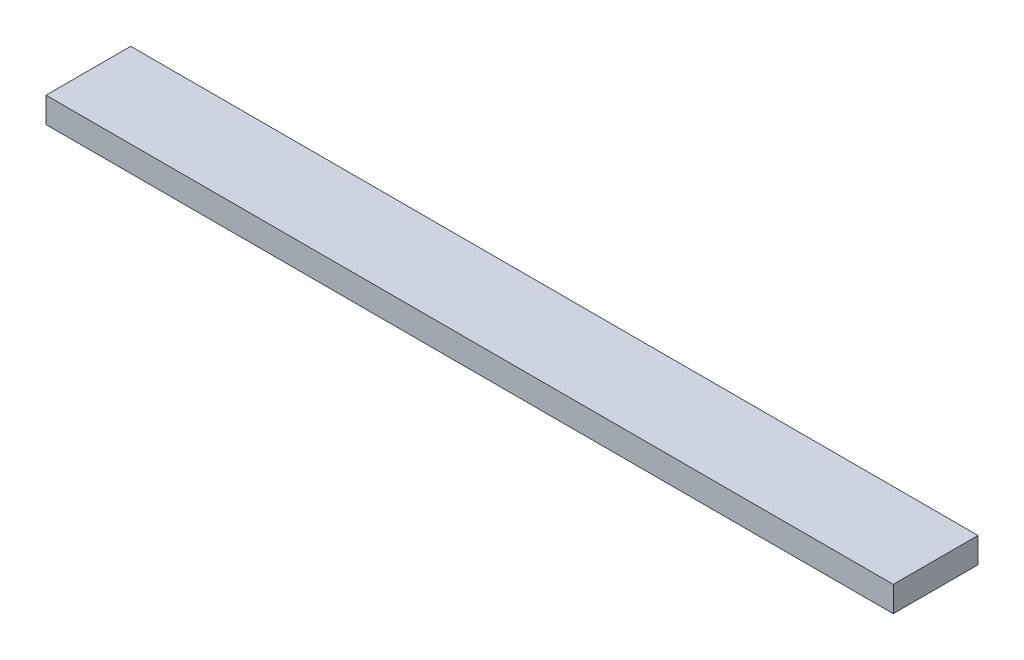
ISO-10303-21;
HEADER;
FILE_DESCRIPTION(('STEP AP214'),'2;1');
FILE_NAME('part.step','',(''),(''),'','','');
FILE_SCHEMA(('AUTOMOTIVE_DESIGN { 1 0 10303 214 1 1 1 1 }'));
ENDSEC;
DATA;
#1=APPLICATION_CONTEXT('core data for automotive mechanical design processes');
#2=APPLICATION_PROTOCOL_DEFINITION('international standard','automotive_design',2000,#1);
#3=PRODUCT_CONTEXT('',#1,'mechanical');
#4=PRODUCT('Part','Part','',(#3));
#5=PRODUCT_RELATED_PRODUCT_CATEGORY('part','',(#4));
#6=PRODUCT_DEFINITION_FORMATION('','',#4);
#7=PRODUCT_DEFINITION_CONTEXT('part definition',#1,'design');
#8=PRODUCT_DEFINITION('design','',#6,#7);
#9=PRODUCT_DEFINITION_SHAPE('','',#8);
#10=(LENGTH_UNIT() NAMED_UNIT(*) SI_UNIT(.MILLI.,.METRE.));
#11=(NAMED_UNIT(*) PLANE_ANGLE_UNIT() SI_UNIT($,.RADIAN.));
#12=(NAMED_UNIT(*) SI_UNIT($,.STERADIAN.) SOLID_ANGLE_UNIT());
#13=UNCERTAINTY_MEASURE_WITH_UNIT(LENGTH_MEASURE(1.E-05),#10,'distance_accuracy_value','');
#14=(GEOMETRIC_REPRESENTATION_CONTEXT(3) GLOBAL_UNCERTAINTY_ASSIGNED_CONTEXT((#13)) GLOBAL_UNIT_ASSIGNED_CONTEXT((#10,
#11,#12)) REPRESENTATION_CONTEXT('',''));
#15=CARTESIAN_POINT('',(0.,0.,0.));
#16=DIRECTION('',(0.,0.,1.));
#17=DIRECTION('',(1.,0.,0.));
#18=AXIS2_PLACEMENT_3D('',#15,#16,#17);
#19=CARTESIAN_POINT('',(0.,6.,0.));
#20=DIRECTION('',(1.,0.,0.));
#21=DIRECTION('',(0.,0.,-1.));
#22=AXIS2_PLACEMENT_3D('',#19,#20,#21);
#23=PLANE('',#22);
#24=DIRECTION('',(0.,0.,1.));
#25=VECTOR('',#24,1.);
#26=CARTESIAN_POINT('',(0.,0.,0.));
#27=LINE('',#26,#25);
#28=CARTESIAN_POINT('',(0.,0.,-20.));
#29=VERTEX_POINT('',#28);
#30=CARTESIAN_POINT('',(0.,0.,0.));
#31=VERTEX_POINT('',#30);
#32=EDGE_CURVE('E95',#29,#31,#27,.T.);
#33=ORIENTED_EDGE('',*,*,#32,.T.);
#34=DIRECTION('',(0.,-1.,0.));
#35=VECTOR('',#34,1.);
#36=CARTESIAN_POINT('',(0.,6.,0.));
#37=LINE('',#36,#35);
#38=CARTESIAN_POINT('',(0.,6.,0.));
#39=VERTEX_POINT('',#38);
#40=EDGE_CURVE('E11',#39,#31,#37,.T.);
#41=ORIENTED_EDGE('',*,*,#40,.F.);
#42=DIRECTION('',(0.,0.,1.));
#43=VECTOR('',#42,1.);
#44=CARTESIAN_POINT('',(0.,6.,0.));
#45=LINE('',#44,#43);
#46=CARTESIAN_POINT('',(0.,6.,-20.));
#47=VERTEX_POINT('',#46);
#48=EDGE_CURVE('E83',#47,#39,#45,.T.);
#49=ORIENTED_EDGE('',*,*,#48,.F.);
#50=DIRECTION('',(0.,-1.,0.));
#51=VECTOR('',#50,1.);
#52=CARTESIAN_POINT('',(0.,6.,-20.));
#53=LINE('',#52,#51);
#54=EDGE_CURVE('E91',#47,#29,#53,.T.);
#55=ORIENTED_EDGE('',*,*,#54,.T.);
#56=EDGE_LOOP('',(#33,#41,#49,#55));
#57=FACE_BOUND('',#56,.T.);
#58=ADVANCED_FACE('F32',(#57),#23,.F.);
#59=CARTESIAN_POINT('',(0.,6.,0.));
#60=DIRECTION('',(0.,0.,-1.));
#61=DIRECTION('',(-1.,0.,0.));
#62=AXIS2_PLACEMENT_3D('',#59,#60,#61);
#63=PLANE('',#62);
#64=DIRECTION('',(1.,0.,0.));
#65=VECTOR('',#64,1.);
#66=CARTESIAN_POINT('',(0.,0.,0.));
#67=LINE('',#66,#65);
#68=CARTESIAN_POINT('',(200.,0.,0.));
#69=VERTEX_POINT('',#68);
#70=EDGE_CURVE('E87',#31,#69,#67,.T.);
#71=ORIENTED_EDGE('',*,*,#70,.T.);
#72=DIRECTION('',(0.,-1.,0.));
#73=VECTOR('',#72,1.);
#74=CARTESIAN_POINT('',(200.,6.,0.));
#75=LINE('',#74,#73);
#76=CARTESIAN_POINT('',(200.,6.,0.));
#77=VERTEX_POINT('',#76);
#78=EDGE_CURVE('E40',#77,#69,#75,.T.);
#79=ORIENTED_EDGE('',*,*,#78,.F.);
#80=DIRECTION('',(1.,0.,0.));
#81=VECTOR('',#80,1.);
#82=CARTESIAN_POINT('',(0.,6.,0.));
#83=LINE('',#82,#81);
#84=EDGE_CURVE('E78',#39,#77,#83,.T.);
#85=ORIENTED_EDGE('',*,*,#84,.F.);
#86=ORIENTED_EDGE('',*,*,#40,.T.);
#87=EDGE_LOOP('',(#71,#79,#85,#86));
#88=FACE_BOUND('',#87,.T.);
#89=ADVANCED_FACE('F86',(#88),#63,.F.);
#90=CARTESIAN_POINT('',(200.,6.,0.));
#91=DIRECTION('',(-1.,0.,0.));
#92=DIRECTION('',(0.,0.,1.));
#93=AXIS2_PLACEMENT_3D('',#90,#91,#92);
#94=PLANE('',#93);
#95=DIRECTION('',(0.,0.,-1.));
#96=VECTOR('',#95,1.);
#97=CARTESIAN_POINT('',(200.,0.,0.));
#98=LINE('',#97,#96);
#99=CARTESIAN_POINT('',(200.,0.,-20.));
#100=VERTEX_POINT('',#99);
#101=EDGE_CURVE('E65',#69,#100,#98,.T.);
#102=ORIENTED_EDGE('',*,*,#101,.T.);
#103=DIRECTION('',(0.,-1.,0.));
#104=VECTOR('',#103,1.);
#105=CARTESIAN_POINT('',(200.,6.,-20.));
#106=LINE('',#105,#104);
#107=CARTESIAN_POINT('',(200.,6.,-20.));
#108=VERTEX_POINT('',#107);
#109=EDGE_CURVE('E88',#108,#100,#106,.T.);
#110=ORIENTED_EDGE('',*,*,#109,.F.);
#111=DIRECTION('',(0.,0.,-1.));
#112=VECTOR('',#111,1.);
#113=CARTESIAN_POINT('',(200.,6.,0.));
#114=LINE('',#113,#112);
#115=EDGE_CURVE('E81',#77,#108,#114,.T.);
#116=ORIENTED_EDGE('',*,*,#115,.F.);
#117=ORIENTED_EDGE('',*,*,#78,.T.);
#118=EDGE_LOOP('',(#102,#110,#116,#117));
#119=FACE_BOUND('',#118,.T.);
#120=ADVANCED_FACE('F89',(#119),#94,.F.);
#121=CARTESIAN_POINT('',(0.,6.,-20.));
#122=DIRECTION('',(0.,0.,1.));
#123=DIRECTION('',(1.,0.,0.));
#124=AXIS2_PLACEMENT_3D('',#121,#122,#123);
#125=PLANE('',#124);
#126=DIRECTION('',(-1.,0.,0.));
#127=VECTOR('',#126,1.);
#128=CARTESIAN_POINT('',(0.,0.,-20.));
#129=LINE('',#128,#127);
#130=EDGE_CURVE('E71',#100,#29,#129,.T.);
#131=ORIENTED_EDGE('',*,*,#130,.T.);
#132=ORIENTED_EDGE('',*,*,#54,.F.);
#133=DIRECTION('',(-1.,0.,0.));
#134=VECTOR('',#133,1.);
#135=CARTESIAN_POINT('',(0.,6.,-20.));
#136=LINE('',#135,#134);
#137=EDGE_CURVE('E48',#108,#47,#136,.T.);
#138=ORIENTED_EDGE('',*,*,#137,.F.);
#139=ORIENTED_EDGE('',*,*,#109,.T.);
#140=EDGE_LOOP('',(#131,#132,#138,#139));
#141=FACE_BOUND('',#140,.T.);
#142=ADVANCED_FACE('F102',(#141),#125,.F.);
#143=CARTESIAN_POINT('',(0.,6.,0.));
#144=DIRECTION('',(0.,-1.,0.));
#145=DIRECTION('',(0.,0.,-1.));
#146=AXIS2_PLACEMENT_3D('',#143,#144,#145);
#147=PLANE('',#146);
#148=ORIENTED_EDGE('',*,*,#48,.T.);
#149=ORIENTED_EDGE('',*,*,#84,.T.);
#150=ORIENTED_EDGE('',*,*,#115,.T.);
#151=ORIENTED_EDGE('',*,*,#137,.T.);
#152=EDGE_LOOP('',(#148,#149,#150,#151));
#153=FACE_BOUND('',#152,.T.);
#154=ADVANCED_FACE('F79',(#153),#147,.F.);
#155=CARTESIAN_POINT('',(0.,0.,0.));
#156=DIRECTION('',(0.,-1.,0.));
#157=DIRECTION('',(0.,0.,-1.));
#158=AXIS2_PLACEMENT_3D('',#155,#156,#157);
#159=PLANE('',#158);
#160=ORIENTED_EDGE('',*,*,#32,.F.);
#161=ORIENTED_EDGE('',*,*,#130,.F.);
#162=ORIENTED_EDGE('',*,*,#101,.F.);
#163=ORIENTED_EDGE('',*,*,#70,.F.);
#164=EDGE_LOOP('',(#160,#161,#162,#163));
#165=FACE_BOUND('',#164,.T.);
#166=ADVANCED_FACE('F105',(#165),#159,.T.);
#167=CLOSED_SHELL('',(#58,#89,#120,#142,#154,#166));
#168=MANIFOLD_SOLID_BREP('B2',#167);
#169=ADVANCED_BREP_SHAPE_REPRESENTATION('',(#18,#168),#14);
#170=SHAPE_DEFINITION_REPRESENTATION(#9,#169);
ENDSEC;
END-ISO-10303-21;
